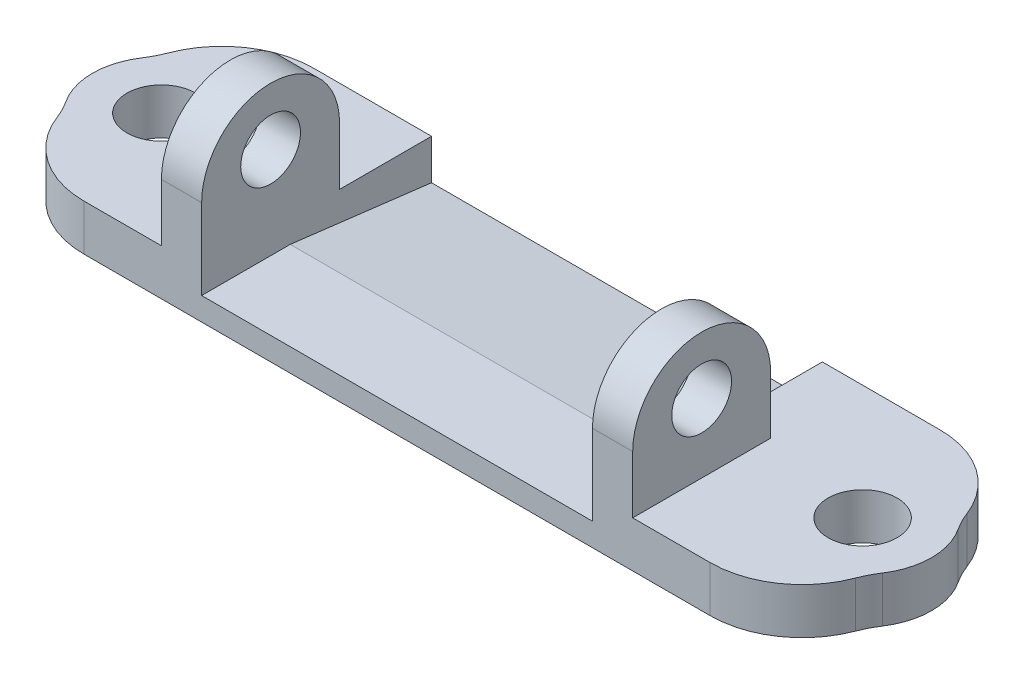
ISO-10303-21;
HEADER;
FILE_DESCRIPTION(('STEP AP214'),'2;1');
FILE_NAME('part.step','',(''),(''),'','','');
FILE_SCHEMA(('AUTOMOTIVE_DESIGN { 1 0 10303 214 1 1 1 1 }'));
ENDSEC;
DATA;
#1=APPLICATION_CONTEXT('core data for automotive mechanical design processes');
#2=APPLICATION_PROTOCOL_DEFINITION('international standard','automotive_design',2000,#1);
#3=PRODUCT_CONTEXT('',#1,'mechanical');
#4=PRODUCT('Part','Part','',(#3));
#5=PRODUCT_RELATED_PRODUCT_CATEGORY('part','',(#4));
#6=PRODUCT_DEFINITION_FORMATION('','',#4);
#7=PRODUCT_DEFINITION_CONTEXT('part definition',#1,'design');
#8=PRODUCT_DEFINITION('design','',#6,#7);
#9=PRODUCT_DEFINITION_SHAPE('','',#8);
#10=(LENGTH_UNIT() NAMED_UNIT(*) SI_UNIT(.MILLI.,.METRE.));
#11=(NAMED_UNIT(*) PLANE_ANGLE_UNIT() SI_UNIT($,.RADIAN.));
#12=(NAMED_UNIT(*) SI_UNIT($,.STERADIAN.) SOLID_ANGLE_UNIT());
#13=UNCERTAINTY_MEASURE_WITH_UNIT(LENGTH_MEASURE(1.E-05),#10,'distance_accuracy_value','');
#14=(GEOMETRIC_REPRESENTATION_CONTEXT(3) GLOBAL_UNCERTAINTY_ASSIGNED_CONTEXT((#13)) GLOBAL_UNIT_ASSIGNED_CONTEXT((#10,
#11,#12)) REPRESENTATION_CONTEXT('',''));
#15=CARTESIAN_POINT('',(0.,0.,0.));
#16=DIRECTION('',(0.,0.,1.));
#17=DIRECTION('',(1.,0.,0.));
#18=AXIS2_PLACEMENT_3D('',#15,#16,#17);
#19=CARTESIAN_POINT('',(7.75399947552149,0.,-8.));
#20=DIRECTION('',(0.,1.,0.));
#21=DIRECTION('',(0.,0.,1.));
#22=AXIS2_PLACEMENT_3D('',#19,#20,#21);
#23=PLANE('',#22);
#24=CARTESIAN_POINT('',(4.5,0.,-9.99999999999998));
#25=DIRECTION('',(0.,-1.,0.));
#26=DIRECTION('',(0.,0.,-1.));
#27=AXIS2_PLACEMENT_3D('',#24,#25,#26);
#28=CIRCLE('',#27,2.99999999999999);
#29=CARTESIAN_POINT('',(4.5,0.,-13.));
#30=VERTEX_POINT('',#29);
#31=EDGE_CURVE('E455',#30,#30,#28,.T.);
#32=ORIENTED_EDGE('',*,*,#31,.F.);
#33=EDGE_LOOP('',(#32));
#34=FACE_BOUND('',#33,.T.);
#35=CARTESIAN_POINT('',(7.75399947552149,0.,-8.));
#36=DIRECTION('',(0.,1.,0.));
#37=DIRECTION('',(0.,0.,1.));
#38=AXIS2_PLACEMENT_3D('',#35,#36,#37);
#39=CIRCLE('',#38,8.);
#40=CARTESIAN_POINT('',(0.276161778442235,0.,-5.1571241011714));
#41=VERTEX_POINT('',#40);
#42=CARTESIAN_POINT('',(7.75399947552149,0.,0.));
#43=VERTEX_POINT('',#42);
#44=EDGE_CURVE('E288',#41,#43,#39,.T.);
#45=ORIENTED_EDGE('',*,*,#44,.F.);
#46=CARTESIAN_POINT('',(-7.20167591863702,0.,-2.31424820234281));
#47=DIRECTION('',(0.,-1.,0.));
#48=DIRECTION('',(0.,0.,-1.));
#49=AXIS2_PLACEMENT_3D('',#46,#47,#48);
#50=CIRCLE('',#49,8.);
#51=CARTESIAN_POINT('',(-0.515003965130155,0.,-6.70610637243263));
#52=VERTEX_POINT('',#51);
#53=EDGE_CURVE('E333',#52,#41,#50,.T.);
#54=ORIENTED_EDGE('',*,*,#53,.F.);
#55=CARTESIAN_POINT('',(4.5,0.,-10.));
#56=DIRECTION('',(0.,1.,0.));
#57=DIRECTION('',(0.,0.,1.));
#58=AXIS2_PLACEMENT_3D('',#55,#56,#57);
#59=CIRCLE('',#58,6.00000000000001);
#60=CARTESIAN_POINT('',(-0.51500396513015,0.,-13.2938936275674));
#61=VERTEX_POINT('',#60);
#62=EDGE_CURVE('E330',#61,#52,#59,.T.);
#63=ORIENTED_EDGE('',*,*,#62,.F.);
#64=CARTESIAN_POINT('',(-7.20167591863702,0.,-17.6857517976572));
#65=DIRECTION('',(0.,-1.,0.));
#66=DIRECTION('',(0.,0.,-1.));
#67=AXIS2_PLACEMENT_3D('',#64,#65,#66);
#68=CIRCLE('',#67,8.);
#69=CARTESIAN_POINT('',(0.276161778442237,0.,-14.8428758988286));
#70=VERTEX_POINT('',#69);
#71=EDGE_CURVE('E327',#70,#61,#68,.T.);
#72=ORIENTED_EDGE('',*,*,#71,.F.);
#73=CARTESIAN_POINT('',(7.75399947552149,0.,-12.));
#74=DIRECTION('',(0.,1.,0.));
#75=DIRECTION('',(0.,0.,1.));
#76=AXIS2_PLACEMENT_3D('',#73,#74,#75);
#77=CIRCLE('',#76,8.);
#78=CARTESIAN_POINT('',(7.75399947552149,0.,-20.));
#79=VERTEX_POINT('',#78);
#80=EDGE_CURVE('E324',#79,#70,#77,.T.);
#81=ORIENTED_EDGE('',*,*,#80,.F.);
#82=DIRECTION('',(-1.,0.,0.));
#83=VECTOR('',#82,1.);
#84=CARTESIAN_POINT('',(18.,0.,-20.));
#85=LINE('',#84,#83);
#86=CARTESIAN_POINT('',(18.,0.,-20.));
#87=VERTEX_POINT('',#86);
#88=EDGE_CURVE('E318',#87,#79,#85,.T.);
#89=ORIENTED_EDGE('',*,*,#88,.F.);
#90=CARTESIAN_POINT('',(52.,0.,-20.));
#91=CARTESIAN_POINT('',(40.6666666666667,0.,-20.));
#92=CARTESIAN_POINT('',(29.3333333333333,0.,-20.));
#93=CARTESIAN_POINT('',(18.,0.,-20.));
#94=B_SPLINE_CURVE_WITH_KNOTS('',3,(#90,#91,#92,#93),.UNSPECIFIED.,.F.,.F.,(4,4),(0.,1.),.UNSPECIFIED.);
#95=CARTESIAN_POINT('',(52.,0.,-20.));
#96=VERTEX_POINT('',#95);
#97=EDGE_CURVE('E313',#96,#87,#94,.T.);
#98=ORIENTED_EDGE('',*,*,#97,.F.);
#99=DIRECTION('',(-1.,0.,0.));
#100=VECTOR('',#99,1.);
#101=CARTESIAN_POINT('',(62.2460005244785,0.,-20.));
#102=LINE('',#101,#100);
#103=CARTESIAN_POINT('',(62.2460005244785,0.,-20.));
#104=VERTEX_POINT('',#103);
#105=EDGE_CURVE('E310',#104,#96,#102,.T.);
#106=ORIENTED_EDGE('',*,*,#105,.F.);
#107=CARTESIAN_POINT('',(62.2460005244785,0.,-12.));
#108=DIRECTION('',(0.,1.,0.));
#109=DIRECTION('',(0.,0.,1.));
#110=AXIS2_PLACEMENT_3D('',#107,#108,#109);
#111=CIRCLE('',#110,8.);
#112=CARTESIAN_POINT('',(69.7238382215578,0.,-14.8428758988286));
#113=VERTEX_POINT('',#112);
#114=EDGE_CURVE('E307',#113,#104,#111,.T.);
#115=ORIENTED_EDGE('',*,*,#114,.F.);
#116=CARTESIAN_POINT('',(77.201675918637,0.,-17.6857517976572));
#117=DIRECTION('',(0.,-1.,0.));
#118=DIRECTION('',(0.,0.,-1.));
#119=AXIS2_PLACEMENT_3D('',#116,#117,#118);
#120=CIRCLE('',#119,8.00000000000001);
#121=CARTESIAN_POINT('',(70.5150039651301,0.,-13.2938936275674));
#122=VERTEX_POINT('',#121);
#123=EDGE_CURVE('E304',#122,#113,#120,.T.);
#124=ORIENTED_EDGE('',*,*,#123,.F.);
#125=CARTESIAN_POINT('',(65.5,0.,-10.));
#126=DIRECTION('',(0.,1.,0.));
#127=DIRECTION('',(0.,0.,1.));
#128=AXIS2_PLACEMENT_3D('',#125,#126,#127);
#129=CIRCLE('',#128,6.);
#130=CARTESIAN_POINT('',(70.5150039651302,0.,-6.70610637243266));
#131=VERTEX_POINT('',#130);
#132=EDGE_CURVE('E301',#131,#122,#129,.T.);
#133=ORIENTED_EDGE('',*,*,#132,.F.);
#134=CARTESIAN_POINT('',(77.201675918637,0.,-2.31424820234283));
#135=DIRECTION('',(0.,-1.,0.));
#136=DIRECTION('',(0.,0.,-1.));
#137=AXIS2_PLACEMENT_3D('',#134,#135,#136);
#138=CIRCLE('',#137,8.);
#139=CARTESIAN_POINT('',(69.7238382215578,0.,-5.15712410117142));
#140=VERTEX_POINT('',#139);
#141=EDGE_CURVE('E298',#140,#131,#138,.T.);
#142=ORIENTED_EDGE('',*,*,#141,.F.);
#143=CARTESIAN_POINT('',(62.2460005244785,0.,-8.));
#144=DIRECTION('',(0.,1.,0.));
#145=DIRECTION('',(0.,0.,1.));
#146=AXIS2_PLACEMENT_3D('',#143,#144,#145);
#147=CIRCLE('',#146,8.);
#148=CARTESIAN_POINT('',(62.2460005244785,0.,0.));
#149=VERTEX_POINT('',#148);
#150=EDGE_CURVE('E295',#149,#140,#147,.T.);
#151=ORIENTED_EDGE('',*,*,#150,.F.);
#152=DIRECTION('',(1.,0.,0.));
#153=VECTOR('',#152,1.);
#154=CARTESIAN_POINT('',(7.75399947552149,0.,0.));
#155=LINE('',#154,#153);
#156=EDGE_CURVE('E291',#43,#149,#155,.T.);
#157=ORIENTED_EDGE('',*,*,#156,.F.);
#158=EDGE_LOOP('',(#45,#54,#63,#72,#81,#89,#98,#106,#115,#124,#133,#142,#151,#157));
#159=FACE_BOUND('',#158,.T.);
#160=CARTESIAN_POINT('',(65.5,0.,-9.99999999999998));
#161=DIRECTION('',(0.,-1.,0.));
#162=DIRECTION('',(0.,0.,-1.));
#163=AXIS2_PLACEMENT_3D('',#160,#161,#162);
#164=CIRCLE('',#163,2.99999999999999);
#165=CARTESIAN_POINT('',(65.5,0.,-13.));
#166=VERTEX_POINT('',#165);
#167=EDGE_CURVE('E468',#166,#166,#164,.T.);
#168=ORIENTED_EDGE('',*,*,#167,.F.);
#169=EDGE_LOOP('',(#168));
#170=FACE_BOUND('',#169,.T.);
#171=ADVANCED_FACE('F32',(#34,#159,#170),#23,.F.);
#172=CARTESIAN_POINT('',(14.5,9.,-6.));
#173=DIRECTION('',(1.,0.,0.));
#174=DIRECTION('',(0.,0.,-1.));
#175=AXIS2_PLACEMENT_3D('',#172,#173,#174);
#176=PLANE('',#175);
#177=DIRECTION('',(0.,-1.,0.));
#178=VECTOR('',#177,1.);
#179=CARTESIAN_POINT('',(14.5,9.,0.));
#180=LINE('',#179,#178);
#181=CARTESIAN_POINT('',(14.5,9.,0.));
#182=VERTEX_POINT('',#181);
#183=CARTESIAN_POINT('',(14.5,4.,0.));
#184=VERTEX_POINT('',#183);
#185=EDGE_CURVE('E233',#182,#184,#180,.T.);
#186=ORIENTED_EDGE('',*,*,#185,.F.);
#187=CARTESIAN_POINT('',(14.5,9.,-6.));
#188=DIRECTION('',(1.,0.,0.));
#189=DIRECTION('',(0.,0.,-1.));
#190=AXIS2_PLACEMENT_3D('',#187,#188,#189);
#191=CIRCLE('',#190,6.);
#192=CARTESIAN_POINT('',(14.5,9.,-12.));
#193=VERTEX_POINT('',#192);
#194=EDGE_CURVE('E241',#193,#182,#191,.T.);
#195=ORIENTED_EDGE('',*,*,#194,.F.);
#196=DIRECTION('',(0.,1.,0.));
#197=VECTOR('',#196,1.);
#198=CARTESIAN_POINT('',(14.5,4.,-12.));
#199=LINE('',#198,#197);
#200=CARTESIAN_POINT('',(14.5,4.,-12.));
#201=VERTEX_POINT('',#200);
#202=EDGE_CURVE('E238',#201,#193,#199,.T.);
#203=ORIENTED_EDGE('',*,*,#202,.F.);
#204=DIRECTION('',(0.,0.,-1.));
#205=VECTOR('',#204,1.);
#206=CARTESIAN_POINT('',(14.5,4.,0.));
#207=LINE('',#206,#205);
#208=EDGE_CURVE('E57',#184,#201,#207,.T.);
#209=ORIENTED_EDGE('',*,*,#208,.F.);
#210=EDGE_LOOP('',(#186,#195,#203,#209));
#211=FACE_BOUND('',#210,.T.);
#212=CARTESIAN_POINT('',(14.5,10.,-6.));
#213=DIRECTION('',(-1.,0.,0.));
#214=DIRECTION('',(0.,0.,1.));
#215=AXIS2_PLACEMENT_3D('',#212,#213,#214);
#216=CIRCLE('',#215,2.59999999999999);
#217=CARTESIAN_POINT('',(14.5,10.,-3.40000000000001));
#218=VERTEX_POINT('',#217);
#219=EDGE_CURVE('E451',#218,#218,#216,.T.);
#220=ORIENTED_EDGE('',*,*,#219,.F.);
#221=EDGE_LOOP('',(#220));
#222=FACE_BOUND('',#221,.T.);
#223=ADVANCED_FACE('F445',(#211,#222),#176,.F.);
#224=CARTESIAN_POINT('',(7.75399947552149,4.,-8.));
#225=DIRECTION('',(0.,1.,0.));
#226=DIRECTION('',(0.,0.,1.));
#227=AXIS2_PLACEMENT_3D('',#224,#225,#226);
#228=PLANE('',#227);
#229=CARTESIAN_POINT('',(65.5,4.,-9.99999999999998));
#230=DIRECTION('',(0.,1.,0.));
#231=DIRECTION('',(0.,0.,1.));
#232=AXIS2_PLACEMENT_3D('',#229,#230,#231);
#233=CIRCLE('',#232,2.99999999999999);
#234=CARTESIAN_POINT('',(65.5,4.,-6.99999999999999));
#235=VERTEX_POINT('',#234);
#236=EDGE_CURVE('E465',#235,#235,#233,.T.);
#237=ORIENTED_EDGE('',*,*,#236,.F.);
#238=EDGE_LOOP('',(#237));
#239=FACE_BOUND('',#238,.T.);
#240=DIRECTION('',(0.,0.,-1.));
#241=VECTOR('',#240,1.);
#242=CARTESIAN_POINT('',(52.,4.,0.));
#243=LINE('',#242,#241);
#244=CARTESIAN_POINT('',(52.,4.,-12.));
#245=VERTEX_POINT('',#244);
#246=CARTESIAN_POINT('',(52.,4.,-20.));
#247=VERTEX_POINT('',#246);
#248=EDGE_CURVE('E262',#245,#247,#243,.T.);
#249=ORIENTED_EDGE('',*,*,#248,.F.);
#250=DIRECTION('',(-1.,0.,0.));
#251=VECTOR('',#250,1.);
#252=CARTESIAN_POINT('',(55.5,4.,-12.));
#253=LINE('',#252,#251);
#254=CARTESIAN_POINT('',(55.5,4.,-12.));
#255=VERTEX_POINT('',#254);
#256=EDGE_CURVE('E229',#255,#245,#253,.T.);
#257=ORIENTED_EDGE('',*,*,#256,.F.);
#258=DIRECTION('',(0.,0.,-1.));
#259=VECTOR('',#258,1.);
#260=CARTESIAN_POINT('',(55.5,4.,0.));
#261=LINE('',#260,#259);
#262=CARTESIAN_POINT('',(55.5,4.,0.));
#263=VERTEX_POINT('',#262);
#264=EDGE_CURVE('E214',#263,#255,#261,.T.);
#265=ORIENTED_EDGE('',*,*,#264,.F.);
#266=DIRECTION('',(1.,0.,0.));
#267=VECTOR('',#266,1.);
#268=CARTESIAN_POINT('',(7.75399947552149,4.,0.));
#269=LINE('',#268,#267);
#270=CARTESIAN_POINT('',(62.2460005244785,4.,0.));
#271=VERTEX_POINT('',#270);
#272=EDGE_CURVE('E219',#263,#271,#269,.T.);
#273=ORIENTED_EDGE('',*,*,#272,.T.);
#274=CARTESIAN_POINT('',(62.2460005244785,4.,-8.));
#275=DIRECTION('',(0.,1.,0.));
#276=DIRECTION('',(0.,0.,1.));
#277=AXIS2_PLACEMENT_3D('',#274,#275,#276);
#278=CIRCLE('',#277,8.);
#279=CARTESIAN_POINT('',(69.7238382215578,4.,-5.15712410117142));
#280=VERTEX_POINT('',#279);
#281=EDGE_CURVE('E341',#271,#280,#278,.T.);
#282=ORIENTED_EDGE('',*,*,#281,.T.);
#283=CARTESIAN_POINT('',(77.201675918637,4.,-2.31424820234283));
#284=DIRECTION('',(0.,-1.,0.));
#285=DIRECTION('',(0.,0.,-1.));
#286=AXIS2_PLACEMENT_3D('',#283,#284,#285);
#287=CIRCLE('',#286,8.);
#288=CARTESIAN_POINT('',(70.5150039651302,4.,-6.70610637243266));
#289=VERTEX_POINT('',#288);
#290=EDGE_CURVE('E344',#280,#289,#287,.T.);
#291=ORIENTED_EDGE('',*,*,#290,.T.);
#292=CARTESIAN_POINT('',(65.5,4.,-10.));
#293=DIRECTION('',(0.,1.,0.));
#294=DIRECTION('',(0.,0.,1.));
#295=AXIS2_PLACEMENT_3D('',#292,#293,#294);
#296=CIRCLE('',#295,6.);
#297=CARTESIAN_POINT('',(70.5150039651301,4.,-13.2938936275674));
#298=VERTEX_POINT('',#297);
#299=EDGE_CURVE('E347',#289,#298,#296,.T.);
#300=ORIENTED_EDGE('',*,*,#299,.T.);
#301=CARTESIAN_POINT('',(77.201675918637,4.,-17.6857517976572));
#302=DIRECTION('',(0.,-1.,0.));
#303=DIRECTION('',(0.,0.,-1.));
#304=AXIS2_PLACEMENT_3D('',#301,#302,#303);
#305=CIRCLE('',#304,8.00000000000001);
#306=CARTESIAN_POINT('',(69.7238382215578,4.,-14.8428758988286));
#307=VERTEX_POINT('',#306);
#308=EDGE_CURVE('E350',#298,#307,#305,.T.);
#309=ORIENTED_EDGE('',*,*,#308,.T.);
#310=CARTESIAN_POINT('',(62.2460005244785,4.,-12.));
#311=DIRECTION('',(0.,1.,0.));
#312=DIRECTION('',(0.,0.,1.));
#313=AXIS2_PLACEMENT_3D('',#310,#311,#312);
#314=CIRCLE('',#313,8.);
#315=CARTESIAN_POINT('',(62.2460005244785,4.,-20.));
#316=VERTEX_POINT('',#315);
#317=EDGE_CURVE('E353',#307,#316,#314,.T.);
#318=ORIENTED_EDGE('',*,*,#317,.T.);
#319=DIRECTION('',(-1.,0.,0.));
#320=VECTOR('',#319,1.);
#321=CARTESIAN_POINT('',(62.2460005244785,4.,-20.));
#322=LINE('',#321,#320);
#323=EDGE_CURVE('E356',#316,#247,#322,.T.);
#324=ORIENTED_EDGE('',*,*,#323,.T.);
#325=EDGE_LOOP('',(#249,#257,#265,#273,#282,#291,#300,#309,#318,#324));
#326=FACE_BOUND('',#325,.T.);
#327=ADVANCED_FACE('F414',(#239,#326),#228,.T.);
#328=CARTESIAN_POINT('',(18.,0.,-20.));
#329=DIRECTION('',(0.,0.,-1.));
#330=DIRECTION('',(-1.,0.,0.));
#331=AXIS2_PLACEMENT_3D('',#328,#329,#330);
#332=PLANE('',#331);
#333=DIRECTION('',(-1.,0.,0.));
#334=VECTOR('',#333,1.);
#335=CARTESIAN_POINT('',(52.,0.49939869372198,-20.));
#336=LINE('',#335,#334);
#337=CARTESIAN_POINT('',(52.,0.49939869372198,-20.));
#338=VERTEX_POINT('',#337);
#339=CARTESIAN_POINT('',(18.,0.49939869372198,-20.));
#340=VERTEX_POINT('',#339);
#341=EDGE_CURVE('E284',#338,#340,#336,.T.);
#342=ORIENTED_EDGE('',*,*,#341,.F.);
#343=DIRECTION('',(0.,-1.,0.));
#344=VECTOR('',#343,1.);
#345=CARTESIAN_POINT('',(52.,4.,-20.));
#346=LINE('',#345,#344);
#347=EDGE_CURVE('E264',#247,#338,#346,.T.);
#348=ORIENTED_EDGE('',*,*,#347,.F.);
#349=ORIENTED_EDGE('',*,*,#323,.F.);
#350=DIRECTION('',(0.,1.,0.));
#351=VECTOR('',#350,1.);
#352=CARTESIAN_POINT('',(62.2460005244785,0.,-20.));
#353=LINE('',#352,#351);
#354=EDGE_CURVE('E380',#104,#316,#353,.T.);
#355=ORIENTED_EDGE('',*,*,#354,.F.);
#356=ORIENTED_EDGE('',*,*,#105,.T.);
#357=ORIENTED_EDGE('',*,*,#97,.T.);
#358=ORIENTED_EDGE('',*,*,#88,.T.);
#359=DIRECTION('',(0.,1.,0.));
#360=VECTOR('',#359,1.);
#361=CARTESIAN_POINT('',(7.75399947552149,0.,-20.));
#362=LINE('',#361,#360);
#363=CARTESIAN_POINT('',(7.75399947552149,4.,-20.));
#364=VERTEX_POINT('',#363);
#365=EDGE_CURVE('E378',#79,#364,#362,.T.);
#366=ORIENTED_EDGE('',*,*,#365,.T.);
#367=DIRECTION('',(-1.,0.,0.));
#368=VECTOR('',#367,1.);
#369=CARTESIAN_POINT('',(18.,4.,-20.));
#370=LINE('',#369,#368);
#371=CARTESIAN_POINT('',(18.,4.,-20.));
#372=VERTEX_POINT('',#371);
#373=EDGE_CURVE('E359',#372,#364,#370,.T.);
#374=ORIENTED_EDGE('',*,*,#373,.F.);
#375=DIRECTION('',(0.,-1.,0.));
#376=VECTOR('',#375,1.);
#377=CARTESIAN_POINT('',(18.,4.,-20.));
#378=LINE('',#377,#376);
#379=EDGE_CURVE('E276',#372,#340,#378,.T.);
#380=ORIENTED_EDGE('',*,*,#379,.T.);
#381=EDGE_LOOP('',(#342,#348,#349,#355,#356,#357,#358,#366,#374,#380));
#382=FACE_BOUND('',#381,.T.);
#383=ADVANCED_FACE('F433',(#382),#332,.T.);
#384=CARTESIAN_POINT('',(7.75399947552149,0.,0.));
#385=DIRECTION('',(0.,0.,1.));
#386=DIRECTION('',(1.,0.,0.));
#387=AXIS2_PLACEMENT_3D('',#384,#385,#386);
#388=PLANE('',#387);
#389=ORIENTED_EDGE('',*,*,#272,.F.);
#390=DIRECTION('',(0.,-1.,0.));
#391=VECTOR('',#390,1.);
#392=CARTESIAN_POINT('',(55.5,9.,0.));
#393=LINE('',#392,#391);
#394=CARTESIAN_POINT('',(55.5,9.,0.));
#395=VERTEX_POINT('',#394);
#396=EDGE_CURVE('E198',#395,#263,#393,.T.);
#397=ORIENTED_EDGE('',*,*,#396,.F.);
#398=DIRECTION('',(-1.,0.,0.));
#399=VECTOR('',#398,1.);
#400=CARTESIAN_POINT('',(55.5,9.,0.));
#401=LINE('',#400,#399);
#402=CARTESIAN_POINT('',(52.,9.,0.));
#403=VERTEX_POINT('',#402);
#404=EDGE_CURVE('E208',#395,#403,#401,.T.);
#405=ORIENTED_EDGE('',*,*,#404,.T.);
#406=DIRECTION('',(0.,1.,0.));
#407=VECTOR('',#406,1.);
#408=CARTESIAN_POINT('',(52.,2.,0.));
#409=LINE('',#408,#407);
#410=CARTESIAN_POINT('',(52.,2.,0.));
#411=VERTEX_POINT('',#410);
#412=EDGE_CURVE('E259',#411,#403,#409,.T.);
#413=ORIENTED_EDGE('',*,*,#412,.F.);
#414=DIRECTION('',(-1.,0.,0.));
#415=VECTOR('',#414,1.);
#416=CARTESIAN_POINT('',(52.,2.,0.));
#417=LINE('',#416,#415);
#418=CARTESIAN_POINT('',(18.,2.,0.));
#419=VERTEX_POINT('',#418);
#420=EDGE_CURVE('E269',#411,#419,#417,.T.);
#421=ORIENTED_EDGE('',*,*,#420,.T.);
#422=DIRECTION('',(0.,1.,0.));
#423=VECTOR('',#422,1.);
#424=CARTESIAN_POINT('',(18.,2.,0.));
#425=LINE('',#424,#423);
#426=CARTESIAN_POINT('',(18.,9.,0.));
#427=VERTEX_POINT('',#426);
#428=EDGE_CURVE('E272',#419,#427,#425,.T.);
#429=ORIENTED_EDGE('',*,*,#428,.T.);
#430=DIRECTION('',(1.,0.,0.));
#431=VECTOR('',#430,1.);
#432=CARTESIAN_POINT('',(14.5,9.,0.));
#433=LINE('',#432,#431);
#434=EDGE_CURVE('E249',#182,#427,#433,.T.);
#435=ORIENTED_EDGE('',*,*,#434,.F.);
#436=ORIENTED_EDGE('',*,*,#185,.T.);
#437=CARTESIAN_POINT('',(7.75399947552149,4.,0.));
#438=VERTEX_POINT('',#437);
#439=EDGE_CURVE('E339',#438,#184,#269,.T.);
#440=ORIENTED_EDGE('',*,*,#439,.F.);
#441=DIRECTION('',(0.,1.,0.));
#442=VECTOR('',#441,1.);
#443=CARTESIAN_POINT('',(7.75399947552149,0.,0.));
#444=LINE('',#443,#442);
#445=EDGE_CURVE('E336',#43,#438,#444,.T.);
#446=ORIENTED_EDGE('',*,*,#445,.F.);
#447=ORIENTED_EDGE('',*,*,#156,.T.);
#448=DIRECTION('',(0.,1.,0.));
#449=VECTOR('',#448,1.);
#450=CARTESIAN_POINT('',(62.2460005244785,0.,0.));
#451=LINE('',#450,#449);
#452=EDGE_CURVE('E390',#149,#271,#451,.T.);
#453=ORIENTED_EDGE('',*,*,#452,.T.);
#454=EDGE_LOOP('',(#389,#397,#405,#413,#421,#429,#435,#436,#440,#446,#447,#453));
#455=FACE_BOUND('',#454,.T.);
#456=ADVANCED_FACE('F217',(#455),#388,.T.);
#457=CARTESIAN_POINT('',(7.75399947552149,0.,-8.));
#458=DIRECTION('',(0.,1.,0.));
#459=DIRECTION('',(0.,0.,1.));
#460=AXIS2_PLACEMENT_3D('',#457,#458,#459);
#461=CYLINDRICAL_SURFACE('',#460,8.);
#462=CARTESIAN_POINT('',(7.75399947552149,4.,-8.));
#463=DIRECTION('',(0.,1.,0.));
#464=DIRECTION('',(0.,0.,1.));
#465=AXIS2_PLACEMENT_3D('',#462,#463,#464);
#466=CIRCLE('',#465,8.);
#467=CARTESIAN_POINT('',(0.276161778442235,4.,-5.1571241011714));
#468=VERTEX_POINT('',#467);
#469=EDGE_CURVE('E283',#468,#438,#466,.T.);
#470=ORIENTED_EDGE('',*,*,#469,.F.);
#471=DIRECTION('',(0.,1.,0.));
#472=VECTOR('',#471,1.);
#473=CARTESIAN_POINT('',(0.276161778442235,0.,-5.1571241011714));
#474=LINE('',#473,#472);
#475=EDGE_CURVE('E11',#41,#468,#474,.T.);
#476=ORIENTED_EDGE('',*,*,#475,.F.);
#477=ORIENTED_EDGE('',*,*,#44,.T.);
#478=ORIENTED_EDGE('',*,*,#445,.T.);
#479=EDGE_LOOP('',(#470,#476,#477,#478));
#480=FACE_BOUND('',#479,.T.);
#481=ADVANCED_FACE('F34',(#480),#461,.T.);
#482=CARTESIAN_POINT('',(-7.20167591863702,0.,-2.31424820234281));
#483=DIRECTION('',(0.,1.,0.));
#484=DIRECTION('',(0.,0.,1.));
#485=AXIS2_PLACEMENT_3D('',#482,#483,#484);
#486=CYLINDRICAL_SURFACE('',#485,8.);
#487=CARTESIAN_POINT('',(-7.20167591863702,4.,-2.31424820234281));
#488=DIRECTION('',(0.,-1.,0.));
#489=DIRECTION('',(0.,0.,-1.));
#490=AXIS2_PLACEMENT_3D('',#487,#488,#489);
#491=CIRCLE('',#490,8.);
#492=CARTESIAN_POINT('',(-0.515003965130155,4.,-6.70610637243263));
#493=VERTEX_POINT('',#492);
#494=EDGE_CURVE('E292',#493,#468,#491,.T.);
#495=ORIENTED_EDGE('',*,*,#494,.F.);
#496=DIRECTION('',(0.,1.,0.));
#497=VECTOR('',#496,1.);
#498=CARTESIAN_POINT('',(-0.515003965130155,0.,-6.70610637243263));
#499=LINE('',#498,#497);
#500=EDGE_CURVE('E41',#52,#493,#499,.T.);
#501=ORIENTED_EDGE('',*,*,#500,.F.);
#502=ORIENTED_EDGE('',*,*,#53,.T.);
#503=ORIENTED_EDGE('',*,*,#475,.T.);
#504=EDGE_LOOP('',(#495,#501,#502,#503));
#505=FACE_BOUND('',#504,.T.);
#506=ADVANCED_FACE('F401',(#505),#486,.F.);
#507=CARTESIAN_POINT('',(4.5,0.,-10.));
#508=DIRECTION('',(0.,1.,0.));
#509=DIRECTION('',(0.,0.,1.));
#510=AXIS2_PLACEMENT_3D('',#507,#508,#509);
#511=CYLINDRICAL_SURFACE('',#510,6.00000000000001);
#512=CARTESIAN_POINT('',(4.5,4.,-10.));
#513=DIRECTION('',(0.,1.,0.));
#514=DIRECTION('',(0.,0.,1.));
#515=AXIS2_PLACEMENT_3D('',#512,#513,#514);
#516=CIRCLE('',#515,6.00000000000001);
#517=CARTESIAN_POINT('',(-0.51500396513015,4.,-13.2938936275674));
#518=VERTEX_POINT('',#517);
#519=EDGE_CURVE('E368',#518,#493,#516,.T.);
#520=ORIENTED_EDGE('',*,*,#519,.F.);
#521=DIRECTION('',(0.,1.,0.));
#522=VECTOR('',#521,1.);
#523=CARTESIAN_POINT('',(-0.51500396513015,0.,-13.2938936275674));
#524=LINE('',#523,#522);
#525=EDGE_CURVE('E374',#61,#518,#524,.T.);
#526=ORIENTED_EDGE('',*,*,#525,.F.);
#527=ORIENTED_EDGE('',*,*,#62,.T.);
#528=ORIENTED_EDGE('',*,*,#500,.T.);
#529=EDGE_LOOP('',(#520,#526,#527,#528));
#530=FACE_BOUND('',#529,.T.);
#531=ADVANCED_FACE('F487',(#530),#511,.T.);
#532=CARTESIAN_POINT('',(-7.20167591863702,0.,-17.6857517976572));
#533=DIRECTION('',(0.,1.,0.));
#534=DIRECTION('',(0.,0.,1.));
#535=AXIS2_PLACEMENT_3D('',#532,#533,#534);
#536=CYLINDRICAL_SURFACE('',#535,8.);
#537=CARTESIAN_POINT('',(-7.20167591863702,4.,-17.6857517976572));
#538=DIRECTION('',(0.,-1.,0.));
#539=DIRECTION('',(0.,0.,-1.));
#540=AXIS2_PLACEMENT_3D('',#537,#538,#539);
#541=CIRCLE('',#540,8.);
#542=CARTESIAN_POINT('',(0.276161778442237,4.,-14.8428758988286));
#543=VERTEX_POINT('',#542);
#544=EDGE_CURVE('E365',#543,#518,#541,.T.);
#545=ORIENTED_EDGE('',*,*,#544,.F.);
#546=DIRECTION('',(0.,1.,0.));
#547=VECTOR('',#546,1.);
#548=CARTESIAN_POINT('',(0.276161778442237,0.,-14.8428758988286));
#549=LINE('',#548,#547);
#550=EDGE_CURVE('E376',#70,#543,#549,.T.);
#551=ORIENTED_EDGE('',*,*,#550,.F.);
#552=ORIENTED_EDGE('',*,*,#71,.T.);
#553=ORIENTED_EDGE('',*,*,#525,.T.);
#554=EDGE_LOOP('',(#545,#551,#552,#553));
#555=FACE_BOUND('',#554,.T.);
#556=ADVANCED_FACE('F490',(#555),#536,.F.);
#557=CARTESIAN_POINT('',(7.75399947552149,0.,-12.));
#558=DIRECTION('',(0.,1.,0.));
#559=DIRECTION('',(0.,0.,1.));
#560=AXIS2_PLACEMENT_3D('',#557,#558,#559);
#561=CYLINDRICAL_SURFACE('',#560,8.);
#562=CARTESIAN_POINT('',(7.75399947552149,4.,-12.));
#563=DIRECTION('',(0.,1.,0.));
#564=DIRECTION('',(0.,0.,1.));
#565=AXIS2_PLACEMENT_3D('',#562,#563,#564);
#566=CIRCLE('',#565,8.);
#567=EDGE_CURVE('E362',#364,#543,#566,.T.);
#568=ORIENTED_EDGE('',*,*,#567,.F.);
#569=ORIENTED_EDGE('',*,*,#365,.F.);
#570=ORIENTED_EDGE('',*,*,#80,.T.);
#571=ORIENTED_EDGE('',*,*,#550,.T.);
#572=EDGE_LOOP('',(#568,#569,#570,#571));
#573=FACE_BOUND('',#572,.T.);
#574=ADVANCED_FACE('F494',(#573),#561,.T.);
#575=CARTESIAN_POINT('',(62.2460005244785,0.,-12.));
#576=DIRECTION('',(0.,1.,0.));
#577=DIRECTION('',(0.,0.,1.));
#578=AXIS2_PLACEMENT_3D('',#575,#576,#577);
#579=CYLINDRICAL_SURFACE('',#578,8.);
#580=ORIENTED_EDGE('',*,*,#317,.F.);
#581=DIRECTION('',(0.,1.,0.));
#582=VECTOR('',#581,1.);
#583=CARTESIAN_POINT('',(69.7238382215578,0.,-14.8428758988286));
#584=LINE('',#583,#582);
#585=EDGE_CURVE('E382',#113,#307,#584,.T.);
#586=ORIENTED_EDGE('',*,*,#585,.F.);
#587=ORIENTED_EDGE('',*,*,#114,.T.);
#588=ORIENTED_EDGE('',*,*,#354,.T.);
#589=EDGE_LOOP('',(#580,#586,#587,#588));
#590=FACE_BOUND('',#589,.T.);
#591=ADVANCED_FACE('F498',(#590),#579,.T.);
#592=CARTESIAN_POINT('',(77.201675918637,0.,-17.6857517976572));
#593=DIRECTION('',(0.,1.,0.));
#594=DIRECTION('',(0.,0.,1.));
#595=AXIS2_PLACEMENT_3D('',#592,#593,#594);
#596=CYLINDRICAL_SURFACE('',#595,8.00000000000001);
#597=ORIENTED_EDGE('',*,*,#308,.F.);
#598=DIRECTION('',(0.,1.,0.));
#599=VECTOR('',#598,1.);
#600=CARTESIAN_POINT('',(70.5150039651301,0.,-13.2938936275674));
#601=LINE('',#600,#599);
#602=EDGE_CURVE('E384',#122,#298,#601,.T.);
#603=ORIENTED_EDGE('',*,*,#602,.F.);
#604=ORIENTED_EDGE('',*,*,#123,.T.);
#605=ORIENTED_EDGE('',*,*,#585,.T.);
#606=EDGE_LOOP('',(#597,#603,#604,#605));
#607=FACE_BOUND('',#606,.T.);
#608=ADVANCED_FACE('F504',(#607),#596,.F.);
#609=CARTESIAN_POINT('',(65.5,0.,-10.));
#610=DIRECTION('',(0.,1.,0.));
#611=DIRECTION('',(0.,0.,1.));
#612=AXIS2_PLACEMENT_3D('',#609,#610,#611);
#613=CYLINDRICAL_SURFACE('',#612,6.);
#614=ORIENTED_EDGE('',*,*,#299,.F.);
#615=DIRECTION('',(0.,1.,0.));
#616=VECTOR('',#615,1.);
#617=CARTESIAN_POINT('',(70.5150039651302,0.,-6.70610637243266));
#618=LINE('',#617,#616);
#619=EDGE_CURVE('E386',#131,#289,#618,.T.);
#620=ORIENTED_EDGE('',*,*,#619,.F.);
#621=ORIENTED_EDGE('',*,*,#132,.T.);
#622=ORIENTED_EDGE('',*,*,#602,.T.);
#623=EDGE_LOOP('',(#614,#620,#621,#622));
#624=FACE_BOUND('',#623,.T.);
#625=ADVANCED_FACE('F508',(#624),#613,.T.);
#626=CARTESIAN_POINT('',(77.201675918637,0.,-2.31424820234283));
#627=DIRECTION('',(0.,1.,0.));
#628=DIRECTION('',(0.,0.,1.));
#629=AXIS2_PLACEMENT_3D('',#626,#627,#628);
#630=CYLINDRICAL_SURFACE('',#629,8.);
#631=ORIENTED_EDGE('',*,*,#290,.F.);
#632=DIRECTION('',(0.,1.,0.));
#633=VECTOR('',#632,1.);
#634=CARTESIAN_POINT('',(69.7238382215578,0.,-5.15712410117142));
#635=LINE('',#634,#633);
#636=EDGE_CURVE('E388',#140,#280,#635,.T.);
#637=ORIENTED_EDGE('',*,*,#636,.F.);
#638=ORIENTED_EDGE('',*,*,#141,.T.);
#639=ORIENTED_EDGE('',*,*,#619,.T.);
#640=EDGE_LOOP('',(#631,#637,#638,#639));
#641=FACE_BOUND('',#640,.T.);
#642=ADVANCED_FACE('F512',(#641),#630,.F.);
#643=CARTESIAN_POINT('',(62.2460005244785,0.,-8.));
#644=DIRECTION('',(0.,1.,0.));
#645=DIRECTION('',(0.,0.,1.));
#646=AXIS2_PLACEMENT_3D('',#643,#644,#645);
#647=CYLINDRICAL_SURFACE('',#646,8.);
#648=ORIENTED_EDGE('',*,*,#281,.F.);
#649=ORIENTED_EDGE('',*,*,#452,.F.);
#650=ORIENTED_EDGE('',*,*,#150,.T.);
#651=ORIENTED_EDGE('',*,*,#636,.T.);
#652=EDGE_LOOP('',(#648,#649,#650,#651));
#653=FACE_BOUND('',#652,.T.);
#654=ADVANCED_FACE('F410',(#653),#647,.T.);
#655=CARTESIAN_POINT('',(4.5,4.,-9.99999999999998));
#656=DIRECTION('',(0.,1.,0.));
#657=DIRECTION('',(0.,0.,1.));
#658=AXIS2_PLACEMENT_3D('',#655,#656,#657);
#659=CIRCLE('',#658,2.99999999999999);
#660=CARTESIAN_POINT('',(4.5,4.,-6.99999999999999));
#661=VERTEX_POINT('',#660);
#662=EDGE_CURVE('E36',#661,#661,#659,.T.);
#663=ORIENTED_EDGE('',*,*,#662,.F.);
#664=EDGE_LOOP('',(#663));
#665=FACE_BOUND('',#664,.T.);
#666=DIRECTION('',(1.,0.,0.));
#667=VECTOR('',#666,1.);
#668=CARTESIAN_POINT('',(14.5,4.,-12.));
#669=LINE('',#668,#667);
#670=CARTESIAN_POINT('',(18.,4.,-12.));
#671=VERTEX_POINT('',#670);
#672=EDGE_CURVE('E244',#201,#671,#669,.T.);
#673=ORIENTED_EDGE('',*,*,#672,.T.);
#674=DIRECTION('',(0.,0.,-1.));
#675=VECTOR('',#674,1.);
#676=CARTESIAN_POINT('',(18.,4.,0.));
#677=LINE('',#676,#675);
#678=EDGE_CURVE('E274',#671,#372,#677,.T.);
#679=ORIENTED_EDGE('',*,*,#678,.T.);
#680=ORIENTED_EDGE('',*,*,#373,.T.);
#681=ORIENTED_EDGE('',*,*,#567,.T.);
#682=ORIENTED_EDGE('',*,*,#544,.T.);
#683=ORIENTED_EDGE('',*,*,#519,.T.);
#684=ORIENTED_EDGE('',*,*,#494,.T.);
#685=ORIENTED_EDGE('',*,*,#469,.T.);
#686=ORIENTED_EDGE('',*,*,#439,.T.);
#687=ORIENTED_EDGE('',*,*,#208,.T.);
#688=EDGE_LOOP('',(#673,#679,#680,#681,#682,#683,#684,#685,#686,#687));
#689=FACE_BOUND('',#688,.T.);
#690=ADVANCED_FACE('F397',(#665,#689),#228,.T.);
#691=CARTESIAN_POINT('',(52.,1.99999999999999,-7.70718819265764));
#692=DIRECTION('',(0.,-1.,0.));
#693=DIRECTION('',(0.,0.,-1.));
#694=AXIS2_PLACEMENT_3D('',#691,#692,#693);
#695=PLANE('',#694);
#696=DIRECTION('',(0.,0.,1.));
#697=VECTOR('',#696,1.);
#698=CARTESIAN_POINT('',(18.,1.99999999999999,-7.70718819265764));
#699=LINE('',#698,#697);
#700=CARTESIAN_POINT('',(18.,1.99999999999999,-7.70718819265764));
#701=VERTEX_POINT('',#700);
#702=EDGE_CURVE('E252',#701,#419,#699,.T.);
#703=ORIENTED_EDGE('',*,*,#702,.T.);
#704=ORIENTED_EDGE('',*,*,#420,.F.);
#705=DIRECTION('',(0.,0.,1.));
#706=VECTOR('',#705,1.);
#707=CARTESIAN_POINT('',(52.,1.99999999999999,-7.70718819265764));
#708=LINE('',#707,#706);
#709=CARTESIAN_POINT('',(52.,1.99999999999999,-7.70718819265764));
#710=VERTEX_POINT('',#709);
#711=EDGE_CURVE('E256',#710,#411,#708,.T.);
#712=ORIENTED_EDGE('',*,*,#711,.F.);
#713=DIRECTION('',(-1.,0.,0.));
#714=VECTOR('',#713,1.);
#715=CARTESIAN_POINT('',(52.,1.99999999999999,-7.70718819265764));
#716=LINE('',#715,#714);
#717=EDGE_CURVE('E281',#710,#701,#716,.T.);
#718=ORIENTED_EDGE('',*,*,#717,.T.);
#719=EDGE_LOOP('',(#703,#704,#712,#718));
#720=FACE_BOUND('',#719,.T.);
#721=ADVANCED_FACE('F421',(#720),#695,.F.);
#722=CARTESIAN_POINT('',(52.,0.49939869372198,-20.));
#723=DIRECTION('',(0.,-0.992631530188763,0.121171965714492));
#724=DIRECTION('',(0.,-0.121171965714492,-0.992631530188763));
#725=AXIS2_PLACEMENT_3D('',#722,#723,#724);
#726=PLANE('',#725);
#727=DIRECTION('',(0.,0.121171965714492,0.992631530188763));
#728=VECTOR('',#727,1.);
#729=CARTESIAN_POINT('',(18.,0.49939869372198,-20.));
#730=LINE('',#729,#728);
#731=EDGE_CURVE('E260',#340,#701,#730,.T.);
#732=ORIENTED_EDGE('',*,*,#731,.T.);
#733=ORIENTED_EDGE('',*,*,#717,.F.);
#734=DIRECTION('',(0.,0.121171965714492,0.992631530188763));
#735=VECTOR('',#734,1.);
#736=CARTESIAN_POINT('',(52.,0.49939869372198,-20.));
#737=LINE('',#736,#735);
#738=EDGE_CURVE('E266',#338,#710,#737,.T.);
#739=ORIENTED_EDGE('',*,*,#738,.F.);
#740=ORIENTED_EDGE('',*,*,#341,.T.);
#741=EDGE_LOOP('',(#732,#733,#739,#740));
#742=FACE_BOUND('',#741,.T.);
#743=ADVANCED_FACE('F428',(#742),#726,.F.);
#744=CARTESIAN_POINT('',(52.,0.,0.));
#745=DIRECTION('',(-1.,0.,0.));
#746=DIRECTION('',(0.,0.,1.));
#747=AXIS2_PLACEMENT_3D('',#744,#745,#746);
#748=PLANE('',#747);
#749=CARTESIAN_POINT('',(52.,10.,-6.));
#750=DIRECTION('',(-1.,0.,0.));
#751=DIRECTION('',(0.,0.,1.));
#752=AXIS2_PLACEMENT_3D('',#749,#750,#751);
#753=CIRCLE('',#752,2.59999999999999);
#754=CARTESIAN_POINT('',(52.,10.,-3.40000000000001));
#755=VERTEX_POINT('',#754);
#756=EDGE_CURVE('E459',#755,#755,#753,.T.);
#757=ORIENTED_EDGE('',*,*,#756,.F.);
#758=EDGE_LOOP('',(#757));
#759=FACE_BOUND('',#758,.T.);
#760=ORIENTED_EDGE('',*,*,#711,.T.);
#761=ORIENTED_EDGE('',*,*,#412,.T.);
#762=CARTESIAN_POINT('',(52.,9.,-6.));
#763=DIRECTION('',(1.,0.,0.));
#764=DIRECTION('',(0.,0.,-1.));
#765=AXIS2_PLACEMENT_3D('',#762,#763,#764);
#766=CIRCLE('',#765,6.);
#767=CARTESIAN_POINT('',(52.,9.,-12.));
#768=VERTEX_POINT('',#767);
#769=EDGE_CURVE('E210',#768,#403,#766,.T.);
#770=ORIENTED_EDGE('',*,*,#769,.F.);
#771=DIRECTION('',(0.,1.,0.));
#772=VECTOR('',#771,1.);
#773=CARTESIAN_POINT('',(52.,4.,-12.));
#774=LINE('',#773,#772);
#775=EDGE_CURVE('E49',#245,#768,#774,.T.);
#776=ORIENTED_EDGE('',*,*,#775,.F.);
#777=ORIENTED_EDGE('',*,*,#248,.T.);
#778=ORIENTED_EDGE('',*,*,#347,.T.);
#779=ORIENTED_EDGE('',*,*,#738,.T.);
#780=EDGE_LOOP('',(#760,#761,#770,#776,#777,#778,#779));
#781=FACE_BOUND('',#780,.T.);
#782=ADVANCED_FACE('F418',(#759,#781),#748,.T.);
#783=CARTESIAN_POINT('',(18.,0.,0.));
#784=DIRECTION('',(-1.,0.,0.));
#785=DIRECTION('',(0.,0.,1.));
#786=AXIS2_PLACEMENT_3D('',#783,#784,#785);
#787=PLANE('',#786);
#788=CARTESIAN_POINT('',(18.,10.,-6.));
#789=DIRECTION('',(-1.,0.,0.));
#790=DIRECTION('',(0.,0.,1.));
#791=AXIS2_PLACEMENT_3D('',#788,#789,#790);
#792=CIRCLE('',#791,2.59999999999999);
#793=CARTESIAN_POINT('',(18.,10.,-3.40000000000001));
#794=VERTEX_POINT('',#793);
#795=EDGE_CURVE('E223',#794,#794,#792,.T.);
#796=ORIENTED_EDGE('',*,*,#795,.T.);
#797=EDGE_LOOP('',(#796));
#798=FACE_BOUND('',#797,.T.);
#799=ORIENTED_EDGE('',*,*,#702,.F.);
#800=ORIENTED_EDGE('',*,*,#731,.F.);
#801=ORIENTED_EDGE('',*,*,#379,.F.);
#802=ORIENTED_EDGE('',*,*,#678,.F.);
#803=DIRECTION('',(0.,1.,0.));
#804=VECTOR('',#803,1.);
#805=CARTESIAN_POINT('',(18.,4.,-12.));
#806=LINE('',#805,#804);
#807=CARTESIAN_POINT('',(18.,9.,-12.));
#808=VERTEX_POINT('',#807);
#809=EDGE_CURVE('E231',#671,#808,#806,.T.);
#810=ORIENTED_EDGE('',*,*,#809,.T.);
#811=CARTESIAN_POINT('',(18.,9.,-6.));
#812=DIRECTION('',(1.,0.,0.));
#813=DIRECTION('',(0.,0.,-1.));
#814=AXIS2_PLACEMENT_3D('',#811,#812,#813);
#815=CIRCLE('',#814,6.);
#816=EDGE_CURVE('E236',#808,#427,#815,.T.);
#817=ORIENTED_EDGE('',*,*,#816,.T.);
#818=ORIENTED_EDGE('',*,*,#428,.F.);
#819=EDGE_LOOP('',(#799,#800,#801,#802,#810,#817,#818));
#820=FACE_BOUND('',#819,.T.);
#821=ADVANCED_FACE('F425',(#798,#820),#787,.F.);
#822=CARTESIAN_POINT('',(14.5,9.,-6.));
#823=DIRECTION('',(1.,0.,0.));
#824=DIRECTION('',(0.,0.,-1.));
#825=AXIS2_PLACEMENT_3D('',#822,#823,#824);
#826=CYLINDRICAL_SURFACE('',#825,6.);
#827=ORIENTED_EDGE('',*,*,#816,.F.);
#828=DIRECTION('',(1.,0.,0.));
#829=VECTOR('',#828,1.);
#830=CARTESIAN_POINT('',(14.5,9.,-12.));
#831=LINE('',#830,#829);
#832=EDGE_CURVE('E253',#193,#808,#831,.T.);
#833=ORIENTED_EDGE('',*,*,#832,.F.);
#834=ORIENTED_EDGE('',*,*,#194,.T.);
#835=ORIENTED_EDGE('',*,*,#434,.T.);
#836=EDGE_LOOP('',(#827,#833,#834,#835));
#837=FACE_BOUND('',#836,.T.);
#838=ADVANCED_FACE('F443',(#837),#826,.T.);
#839=CARTESIAN_POINT('',(14.5,4.,-12.));
#840=DIRECTION('',(0.,0.,-1.));
#841=DIRECTION('',(-1.,0.,0.));
#842=AXIS2_PLACEMENT_3D('',#839,#840,#841);
#843=PLANE('',#842);
#844=ORIENTED_EDGE('',*,*,#809,.F.);
#845=ORIENTED_EDGE('',*,*,#672,.F.);
#846=ORIENTED_EDGE('',*,*,#202,.T.);
#847=ORIENTED_EDGE('',*,*,#832,.T.);
#848=EDGE_LOOP('',(#844,#845,#846,#847));
#849=FACE_BOUND('',#848,.T.);
#850=ADVANCED_FACE('F440',(#849),#843,.T.);
#851=CARTESIAN_POINT('',(55.5,4.,-12.));
#852=DIRECTION('',(0.,0.,1.));
#853=DIRECTION('',(1.,0.,0.));
#854=AXIS2_PLACEMENT_3D('',#851,#852,#853);
#855=PLANE('',#854);
#856=ORIENTED_EDGE('',*,*,#775,.T.);
#857=DIRECTION('',(-1.,0.,0.));
#858=VECTOR('',#857,1.);
#859=CARTESIAN_POINT('',(55.5,9.,-12.));
#860=LINE('',#859,#858);
#861=CARTESIAN_POINT('',(55.5,9.,-12.));
#862=VERTEX_POINT('',#861);
#863=EDGE_CURVE('E213',#862,#768,#860,.T.);
#864=ORIENTED_EDGE('',*,*,#863,.F.);
#865=DIRECTION('',(0.,1.,0.));
#866=VECTOR('',#865,1.);
#867=CARTESIAN_POINT('',(55.5,4.,-12.));
#868=LINE('',#867,#866);
#869=EDGE_CURVE('E201',#255,#862,#868,.T.);
#870=ORIENTED_EDGE('',*,*,#869,.F.);
#871=ORIENTED_EDGE('',*,*,#256,.T.);
#872=EDGE_LOOP('',(#856,#864,#870,#871));
#873=FACE_BOUND('',#872,.T.);
#874=ADVANCED_FACE('F417',(#873),#855,.F.);
#875=CARTESIAN_POINT('',(55.5,9.,-6.));
#876=DIRECTION('',(-1.,0.,0.));
#877=DIRECTION('',(0.,0.,1.));
#878=AXIS2_PLACEMENT_3D('',#875,#876,#877);
#879=CYLINDRICAL_SURFACE('',#878,6.);
#880=ORIENTED_EDGE('',*,*,#769,.T.);
#881=ORIENTED_EDGE('',*,*,#404,.F.);
#882=CARTESIAN_POINT('',(55.5,9.,-6.));
#883=DIRECTION('',(1.,0.,0.));
#884=DIRECTION('',(0.,0.,-1.));
#885=AXIS2_PLACEMENT_3D('',#882,#883,#884);
#886=CIRCLE('',#885,6.);
#887=EDGE_CURVE('E194',#862,#395,#886,.T.);
#888=ORIENTED_EDGE('',*,*,#887,.F.);
#889=ORIENTED_EDGE('',*,*,#863,.T.);
#890=EDGE_LOOP('',(#880,#881,#888,#889));
#891=FACE_BOUND('',#890,.T.);
#892=ADVANCED_FACE('F209',(#891),#879,.T.);
#893=CARTESIAN_POINT('',(55.5,9.,-6.));
#894=DIRECTION('',(-1.,0.,0.));
#895=DIRECTION('',(0.,0.,-1.));
#896=AXIS2_PLACEMENT_3D('',#893,#894,#895);
#897=PLANE('',#896);
#898=CARTESIAN_POINT('',(55.5,10.,-6.));
#899=DIRECTION('',(1.,0.,0.));
#900=DIRECTION('',(0.,0.,-1.));
#901=AXIS2_PLACEMENT_3D('',#898,#899,#900);
#902=CIRCLE('',#901,2.59999999999999);
#903=CARTESIAN_POINT('',(55.5,10.,-8.59999999999999));
#904=VERTEX_POINT('',#903);
#905=EDGE_CURVE('E462',#904,#904,#902,.T.);
#906=ORIENTED_EDGE('',*,*,#905,.F.);
#907=EDGE_LOOP('',(#906));
#908=FACE_BOUND('',#907,.T.);
#909=ORIENTED_EDGE('',*,*,#396,.T.);
#910=ORIENTED_EDGE('',*,*,#264,.T.);
#911=ORIENTED_EDGE('',*,*,#869,.T.);
#912=ORIENTED_EDGE('',*,*,#887,.T.);
#913=EDGE_LOOP('',(#909,#910,#911,#912));
#914=FACE_BOUND('',#913,.T.);
#915=ADVANCED_FACE('F196',(#908,#914),#897,.F.);
#916=CARTESIAN_POINT('',(14.5,10.,-6.));
#917=DIRECTION('',(-1.,0.,0.));
#918=DIRECTION('',(0.,0.,1.));
#919=AXIS2_PLACEMENT_3D('',#916,#917,#918);
#920=CYLINDRICAL_SURFACE('',#919,2.59999999999999);
#921=ORIENTED_EDGE('',*,*,#795,.F.);
#922=EDGE_LOOP('',(#921));
#923=FACE_BOUND('',#922,.T.);
#924=ORIENTED_EDGE('',*,*,#219,.T.);
#925=EDGE_LOOP('',(#924));
#926=FACE_BOUND('',#925,.T.);
#927=ADVANCED_FACE('F623',(#923,#926),#920,.F.);
#928=CARTESIAN_POINT('',(4.5,0.,-9.99999999999998));
#929=DIRECTION('',(0.,-1.,0.));
#930=DIRECTION('',(0.,0.,-1.));
#931=AXIS2_PLACEMENT_3D('',#928,#929,#930);
#932=CYLINDRICAL_SURFACE('',#931,2.99999999999999);
#933=ORIENTED_EDGE('',*,*,#662,.T.);
#934=EDGE_LOOP('',(#933));
#935=FACE_BOUND('',#934,.T.);
#936=ORIENTED_EDGE('',*,*,#31,.T.);
#937=EDGE_LOOP('',(#936));
#938=FACE_BOUND('',#937,.T.);
#939=ADVANCED_FACE('F631',(#935,#938),#932,.F.);
#940=CARTESIAN_POINT('',(55.5,10.,-6.));
#941=DIRECTION('',(1.,0.,0.));
#942=DIRECTION('',(0.,0.,-1.));
#943=AXIS2_PLACEMENT_3D('',#940,#941,#942);
#944=CYLINDRICAL_SURFACE('',#943,2.59999999999999);
#945=ORIENTED_EDGE('',*,*,#905,.T.);
#946=EDGE_LOOP('',(#945));
#947=FACE_BOUND('',#946,.T.);
#948=ORIENTED_EDGE('',*,*,#756,.T.);
#949=EDGE_LOOP('',(#948));
#950=FACE_BOUND('',#949,.T.);
#951=ADVANCED_FACE('F638',(#947,#950),#944,.F.);
#952=CARTESIAN_POINT('',(65.5,0.,-9.99999999999998));
#953=DIRECTION('',(0.,-1.,0.));
#954=DIRECTION('',(0.,0.,-1.));
#955=AXIS2_PLACEMENT_3D('',#952,#953,#954);
#956=CYLINDRICAL_SURFACE('',#955,2.99999999999999);
#957=ORIENTED_EDGE('',*,*,#236,.T.);
#958=EDGE_LOOP('',(#957));
#959=FACE_BOUND('',#958,.T.);
#960=ORIENTED_EDGE('',*,*,#167,.T.);
#961=EDGE_LOOP('',(#960));
#962=FACE_BOUND('',#961,.T.);
#963=ADVANCED_FACE('F472',(#959,#962),#956,.F.);
#964=CLOSED_SHELL('',(#171,#223,#327,#383,#456,#481,#506,#531,#556,#574,#591,#608,#625,#642,
#654,#690,#721,#743,#782,#821,#838,#850,#874,#892,#915,#927,#939,#951,#963));
#965=MANIFOLD_SOLID_BREP('B2',#964);
#966=ADVANCED_BREP_SHAPE_REPRESENTATION('',(#18,#965),#14);
#967=SHAPE_DEFINITION_REPRESENTATION(#9,#966);
ENDSEC;
END-ISO-10303-21;
